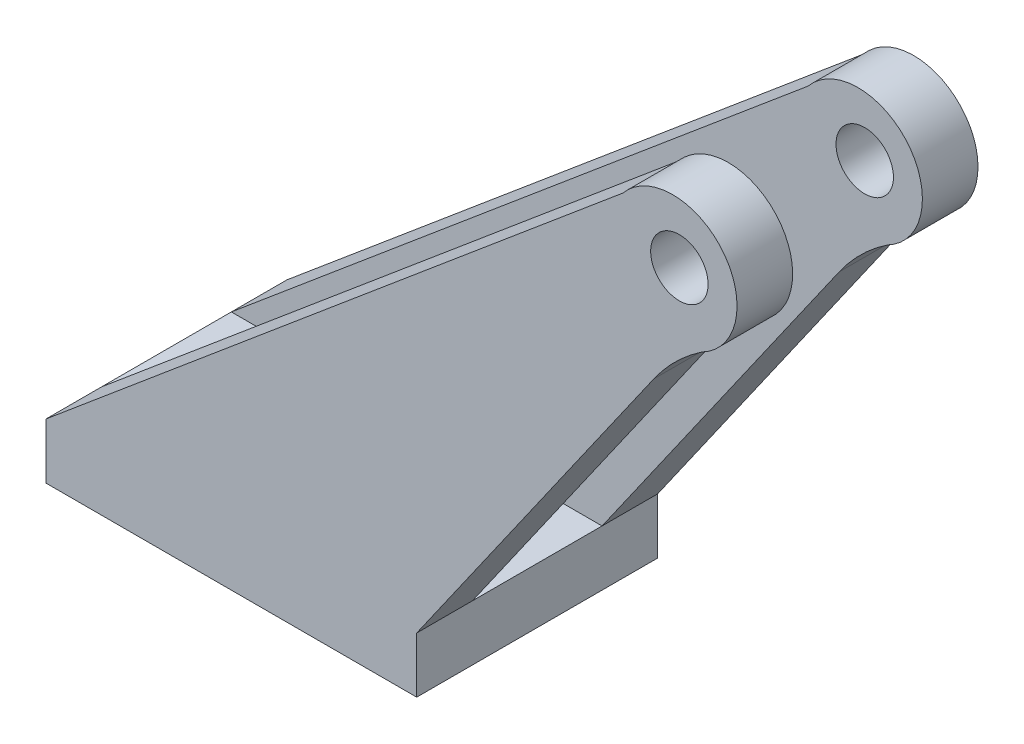
ISO-10303-21;
HEADER;
FILE_DESCRIPTION(('STEP AP214'),'2;1');
FILE_NAME('part.step','',(''),(''),'','','');
FILE_SCHEMA(('AUTOMOTIVE_DESIGN { 1 0 10303 214 1 1 1 1 }'));
ENDSEC;
DATA;
#1=APPLICATION_CONTEXT('core data for automotive mechanical design processes');
#2=APPLICATION_PROTOCOL_DEFINITION('international standard','automotive_design',2000,#1);
#3=PRODUCT_CONTEXT('',#1,'mechanical');
#4=PRODUCT('Part','Part','',(#3));
#5=PRODUCT_RELATED_PRODUCT_CATEGORY('part','',(#4));
#6=PRODUCT_DEFINITION_FORMATION('','',#4);
#7=PRODUCT_DEFINITION_CONTEXT('part definition',#1,'design');
#8=PRODUCT_DEFINITION('design','',#6,#7);
#9=PRODUCT_DEFINITION_SHAPE('','',#8);
#10=(LENGTH_UNIT() NAMED_UNIT(*) SI_UNIT(.MILLI.,.METRE.));
#11=(NAMED_UNIT(*) PLANE_ANGLE_UNIT() SI_UNIT($,.RADIAN.));
#12=(NAMED_UNIT(*) SI_UNIT($,.STERADIAN.) SOLID_ANGLE_UNIT());
#13=UNCERTAINTY_MEASURE_WITH_UNIT(LENGTH_MEASURE(1.E-05),#10,'distance_accuracy_value','');
#14=(GEOMETRIC_REPRESENTATION_CONTEXT(3) GLOBAL_UNCERTAINTY_ASSIGNED_CONTEXT((#13)) GLOBAL_UNIT_ASSIGNED_CONTEXT((#10,
#11,#12)) REPRESENTATION_CONTEXT('',''));
#15=CARTESIAN_POINT('',(0.,0.,0.));
#16=DIRECTION('',(0.,0.,1.));
#17=DIRECTION('',(1.,0.,0.));
#18=AXIS2_PLACEMENT_3D('',#15,#16,#17);
#19=CARTESIAN_POINT('',(66.3277408616516,15.5347398559066,-44.2194258680597));
#20=DIRECTION('',(0.,0.,1.));
#21=DIRECTION('',(1.,0.,0.));
#22=AXIS2_PLACEMENT_3D('',#19,#20,#21);
#23=PLANE('',#22);
#24=CARTESIAN_POINT('',(59.5129486185114,27.150635094611,-44.2194258680597));
#25=DIRECTION('',(0.,0.,-1.));
#26=DIRECTION('',(-1.,0.,0.));
#27=AXIS2_PLACEMENT_3D('',#24,#25,#26);
#28=CIRCLE('',#27,1.55);
#29=CARTESIAN_POINT('',(57.9629486185114,27.150635094611,-44.2194258680597));
#30=VERTEX_POINT('',#29);
#31=EDGE_CURVE('E93',#30,#30,#28,.F.);
#32=ORIENTED_EDGE('',*,*,#31,.T.);
#33=EDGE_LOOP('',(#32));
#34=FACE_BOUND('',#33,.T.);
#35=DIRECTION('',(0.766044443118982,0.642787609686535,0.));
#36=VECTOR('',#35,1.);
#37=CARTESIAN_POINT('',(56.4724291693294,29.1206290674007,-44.2194258680597));
#38=LINE('',#37,#36);
#39=CARTESIAN_POINT('',(25.3430756374335,3.,-44.2194258680597));
#40=VERTEX_POINT('',#39);
#41=CARTESIAN_POINT('',(56.4724291693294,29.1206290674007,-44.2194258680597));
#42=VERTEX_POINT('',#41);
#43=EDGE_CURVE('E112',#40,#42,#38,.T.);
#44=ORIENTED_EDGE('',*,*,#43,.T.);
#45=CARTESIAN_POINT('',(59.1535799659421,26.9161629802591,-44.2194258680597));
#46=DIRECTION('',(0.,0.,-1.));
#47=DIRECTION('',(-1.,0.,0.));
#48=AXIS2_PLACEMENT_3D('',#45,#46,#47);
#49=CIRCLE('',#48,3.47105752236036);
#50=CARTESIAN_POINT('',(60.7457464022657,23.8318078835526,-44.2194258680597));
#51=VERTEX_POINT('',#50);
#52=EDGE_CURVE('E75',#51,#42,#49,.F.);
#53=ORIENTED_EDGE('',*,*,#52,.F.);
#54=CARTESIAN_POINT('',(66.3277408616516,15.5347398559066,-44.2194258680597));
#55=DIRECTION('',(0.,0.,-1.));
#56=DIRECTION('',(-1.,0.,0.));
#57=AXIS2_PLACEMENT_3D('',#54,#55,#56);
#58=CIRCLE('',#57,10.);
#59=CARTESIAN_POINT('',(58.1362204187617,21.2705042194171,-44.2194258680597));
#60=VERTEX_POINT('',#59);
#61=EDGE_CURVE('E21',#51,#60,#58,.F.);
#62=ORIENTED_EDGE('',*,*,#61,.T.);
#63=DIRECTION('',(-0.573576436351045,-0.819152044288992,0.));
#64=VECTOR('',#63,1.);
#65=CARTESIAN_POINT('',(45.3430756374336,3.,-44.2194258680597));
#66=LINE('',#65,#64);
#67=CARTESIAN_POINT('',(45.3430756374336,3.,-44.2194258680597));
#68=VERTEX_POINT('',#67);
#69=EDGE_CURVE('E81',#60,#68,#66,.T.);
#70=ORIENTED_EDGE('',*,*,#69,.T.);
#71=DIRECTION('',(1.,0.,0.));
#72=VECTOR('',#71,1.);
#73=CARTESIAN_POINT('',(0.,3.,-44.2194258680597));
#74=LINE('',#73,#72);
#75=EDGE_CURVE('E102',#68,#40,#74,.F.);
#76=ORIENTED_EDGE('',*,*,#75,.T.);
#77=EDGE_LOOP('',(#44,#53,#62,#70,#76));
#78=FACE_BOUND('',#77,.T.);
#79=ADVANCED_FACE('F18',(#34,#78),#23,.F.);
#80=CARTESIAN_POINT('',(66.3277408616516,15.5347398559066,-41.2194258680597));
#81=DIRECTION('',(0.,0.,-1.));
#82=DIRECTION('',(-1.,0.,0.));
#83=AXIS2_PLACEMENT_3D('',#80,#81,#82);
#84=CYLINDRICAL_SURFACE('',#83,10.);
#85=DIRECTION('',(0.,0.,-1.));
#86=VECTOR('',#85,1.);
#87=CARTESIAN_POINT('',(60.7457464022657,23.8318078835526,-41.2194258680597));
#88=LINE('',#87,#86);
#89=CARTESIAN_POINT('',(60.7457464022657,23.8318078835526,-41.2194258680597));
#90=VERTEX_POINT('',#89);
#91=EDGE_CURVE('E114',#90,#51,#88,.T.);
#92=ORIENTED_EDGE('',*,*,#91,.F.);
#93=CARTESIAN_POINT('',(66.3277408616516,15.5347398559066,-41.2194258680597));
#94=DIRECTION('',(0.,0.,-1.));
#95=DIRECTION('',(-1.,0.,0.));
#96=AXIS2_PLACEMENT_3D('',#93,#94,#95);
#97=CIRCLE('',#96,10.);
#98=CARTESIAN_POINT('',(58.1362204187617,21.2705042194171,-41.2194258680597));
#99=VERTEX_POINT('',#98);
#100=EDGE_CURVE('E89',#99,#90,#97,.T.);
#101=ORIENTED_EDGE('',*,*,#100,.F.);
#102=DIRECTION('',(0.,0.,1.));
#103=VECTOR('',#102,1.);
#104=CARTESIAN_POINT('',(58.1362204187617,21.2705042194171,-41.2194258680597));
#105=LINE('',#104,#103);
#106=EDGE_CURVE('E86',#99,#60,#105,.F.);
#107=ORIENTED_EDGE('',*,*,#106,.T.);
#108=ORIENTED_EDGE('',*,*,#61,.F.);
#109=EDGE_LOOP('',(#92,#101,#107,#108));
#110=FACE_BOUND('',#109,.T.);
#111=ADVANCED_FACE('F87',(#110),#84,.F.);
#112=CARTESIAN_POINT('',(59.1535799659421,26.9161629802591,-41.2194258680597));
#113=DIRECTION('',(0.,0.,-1.));
#114=DIRECTION('',(-1.,0.,0.));
#115=AXIS2_PLACEMENT_3D('',#112,#113,#114);
#116=CYLINDRICAL_SURFACE('',#115,3.47105752236036);
#117=CARTESIAN_POINT('',(59.1535799659421,26.9161629802591,-41.2194258680597));
#118=DIRECTION('',(0.,0.,-1.));
#119=DIRECTION('',(-1.,0.,0.));
#120=AXIS2_PLACEMENT_3D('',#117,#118,#119);
#121=CIRCLE('',#120,3.47105752236036);
#122=CARTESIAN_POINT('',(56.4724291693294,29.1206290674007,-41.2194258680597));
#123=VERTEX_POINT('',#122);
#124=EDGE_CURVE('E149',#90,#123,#121,.F.);
#125=ORIENTED_EDGE('',*,*,#124,.F.);
#126=ORIENTED_EDGE('',*,*,#91,.T.);
#127=ORIENTED_EDGE('',*,*,#52,.T.);
#128=DIRECTION('',(0.,0.,1.));
#129=VECTOR('',#128,1.);
#130=CARTESIAN_POINT('',(56.4724291693294,29.1206290674007,-41.2194258680597));
#131=LINE('',#130,#129);
#132=EDGE_CURVE('E110',#42,#123,#131,.T.);
#133=ORIENTED_EDGE('',*,*,#132,.T.);
#134=EDGE_LOOP('',(#125,#126,#127,#133));
#135=FACE_BOUND('',#134,.T.);
#136=ADVANCED_FACE('F159',(#135),#116,.T.);
#137=CARTESIAN_POINT('',(59.5129486185114,27.150635094611,-41.2194258680597));
#138=DIRECTION('',(0.,0.,-1.));
#139=DIRECTION('',(-1.,0.,0.));
#140=AXIS2_PLACEMENT_3D('',#137,#138,#139);
#141=CYLINDRICAL_SURFACE('',#140,1.55);
#142=CARTESIAN_POINT('',(59.5129486185114,27.150635094611,-41.2194258680597));
#143=DIRECTION('',(0.,0.,-1.));
#144=DIRECTION('',(-1.,0.,0.));
#145=AXIS2_PLACEMENT_3D('',#142,#143,#144);
#146=CIRCLE('',#145,1.55);
#147=CARTESIAN_POINT('',(57.9629486185114,27.150635094611,-41.2194258680597));
#148=VERTEX_POINT('',#147);
#149=EDGE_CURVE('E144',#148,#148,#146,.T.);
#150=ORIENTED_EDGE('',*,*,#149,.F.);
#151=EDGE_LOOP('',(#150));
#152=FACE_BOUND('',#151,.T.);
#153=ORIENTED_EDGE('',*,*,#31,.F.);
#154=EDGE_LOOP('',(#153));
#155=FACE_BOUND('',#154,.T.);
#156=ADVANCED_FACE('F336',(#152,#155),#141,.F.);
#157=CARTESIAN_POINT('',(45.3430756374336,3.,-41.2194258680597));
#158=DIRECTION('',(-0.819152044288992,0.573576436351045,0.));
#159=DIRECTION('',(-0.573576436351045,-0.819152044288992,0.));
#160=AXIS2_PLACEMENT_3D('',#157,#158,#159);
#161=PLANE('',#160);
#162=ORIENTED_EDGE('',*,*,#106,.F.);
#163=DIRECTION('',(0.573576436351045,0.819152044288992,0.));
#164=VECTOR('',#163,1.);
#165=CARTESIAN_POINT('',(45.3430756374336,3.,-41.2194258680597));
#166=LINE('',#165,#164);
#167=CARTESIAN_POINT('',(45.3430756374336,3.,-41.2194258680597));
#168=VERTEX_POINT('',#167);
#169=EDGE_CURVE('E153',#168,#99,#166,.T.);
#170=ORIENTED_EDGE('',*,*,#169,.F.);
#171=DIRECTION('',(0.,0.,1.));
#172=VECTOR('',#171,1.);
#173=CARTESIAN_POINT('',(45.3430756374336,3.,-51.2194258680596));
#174=LINE('',#173,#172);
#175=EDGE_CURVE('E97',#168,#68,#174,.F.);
#176=ORIENTED_EDGE('',*,*,#175,.T.);
#177=ORIENTED_EDGE('',*,*,#69,.F.);
#178=EDGE_LOOP('',(#162,#170,#176,#177));
#179=FACE_BOUND('',#178,.T.);
#180=ADVANCED_FACE('F95',(#179),#161,.F.);
#181=CARTESIAN_POINT('',(40.3430756374337,3.,-47.7194258680598));
#182=DIRECTION('',(0.,-1.,0.));
#183=DIRECTION('',(0.,0.,-1.));
#184=AXIS2_PLACEMENT_3D('',#181,#182,#183);
#185=CYLINDRICAL_SURFACE('',#184,1.59999999999982);
#186=CARTESIAN_POINT('',(40.3430756374337,3.,-47.7194258680598));
#187=DIRECTION('',(0.,-1.,0.));
#188=DIRECTION('',(0.,0.,-1.));
#189=AXIS2_PLACEMENT_3D('',#186,#187,#188);
#190=CIRCLE('',#189,1.59999999999982);
#191=CARTESIAN_POINT('',(40.3430756374337,3.,-49.3194258680596));
#192=VERTEX_POINT('',#191);
#193=EDGE_CURVE('E99',#192,#192,#190,.F.);
#194=ORIENTED_EDGE('',*,*,#193,.T.);
#195=EDGE_LOOP('',(#194));
#196=FACE_BOUND('',#195,.T.);
#197=CARTESIAN_POINT('',(40.3430756374337,0.,-47.7194258680598));
#198=DIRECTION('',(0.,-1.,0.));
#199=DIRECTION('',(0.,0.,-1.));
#200=AXIS2_PLACEMENT_3D('',#197,#198,#199);
#201=CIRCLE('',#200,1.59999999999982);
#202=CARTESIAN_POINT('',(40.3430756374337,0.,-49.3194258680596));
#203=VERTEX_POINT('',#202);
#204=EDGE_CURVE('E139',#203,#203,#201,.F.);
#205=ORIENTED_EDGE('',*,*,#204,.F.);
#206=EDGE_LOOP('',(#205));
#207=FACE_BOUND('',#206,.T.);
#208=ADVANCED_FACE('F324',(#196,#207),#185,.F.);
#209=CARTESIAN_POINT('',(30.3430756374334,3.,-47.7194258680598));
#210=DIRECTION('',(0.,-1.,0.));
#211=DIRECTION('',(0.,0.,-1.));
#212=AXIS2_PLACEMENT_3D('',#209,#210,#211);
#213=CYLINDRICAL_SURFACE('',#212,1.59999999999982);
#214=CARTESIAN_POINT('',(30.3430756374334,3.,-47.7194258680598));
#215=DIRECTION('',(0.,-1.,0.));
#216=DIRECTION('',(0.,0.,-1.));
#217=AXIS2_PLACEMENT_3D('',#214,#215,#216);
#218=CIRCLE('',#217,1.59999999999982);
#219=CARTESIAN_POINT('',(30.3430756374334,3.,-49.3194258680596));
#220=VERTEX_POINT('',#219);
#221=EDGE_CURVE('E113',#220,#220,#218,.F.);
#222=ORIENTED_EDGE('',*,*,#221,.T.);
#223=EDGE_LOOP('',(#222));
#224=FACE_BOUND('',#223,.T.);
#225=CARTESIAN_POINT('',(30.3430756374334,0.,-47.7194258680598));
#226=DIRECTION('',(0.,-1.,0.));
#227=DIRECTION('',(0.,0.,-1.));
#228=AXIS2_PLACEMENT_3D('',#225,#226,#227);
#229=CIRCLE('',#228,1.59999999999982);
#230=CARTESIAN_POINT('',(30.3430756374334,0.,-49.3194258680596));
#231=VERTEX_POINT('',#230);
#232=EDGE_CURVE('E134',#231,#231,#229,.F.);
#233=ORIENTED_EDGE('',*,*,#232,.F.);
#234=EDGE_LOOP('',(#233));
#235=FACE_BOUND('',#234,.T.);
#236=ADVANCED_FACE('F326',(#224,#235),#213,.F.);
#237=CARTESIAN_POINT('',(0.,3.,0.));
#238=DIRECTION('',(0.,-1.,0.));
#239=DIRECTION('',(0.,0.,-1.));
#240=AXIS2_PLACEMENT_3D('',#237,#238,#239);
#241=PLANE('',#240);
#242=ORIENTED_EDGE('',*,*,#221,.F.);
#243=EDGE_LOOP('',(#242));
#244=FACE_BOUND('',#243,.T.);
#245=DIRECTION('',(-1.,0.,0.));
#246=VECTOR('',#245,1.);
#247=CARTESIAN_POINT('',(59.1535799659421,3.,-51.2194258680596));
#248=LINE('',#247,#246);
#249=CARTESIAN_POINT('',(45.3430756374336,3.,-51.2194258680596));
#250=VERTEX_POINT('',#249);
#251=CARTESIAN_POINT('',(25.3430756374335,2.99999999999999,-51.2194258680596));
#252=VERTEX_POINT('',#251);
#253=EDGE_CURVE('E147',#250,#252,#248,.T.);
#254=ORIENTED_EDGE('',*,*,#253,.T.);
#255=DIRECTION('',(0.,0.,-1.));
#256=VECTOR('',#255,1.);
#257=CARTESIAN_POINT('',(25.3430756374335,3.,-51.2194258680596));
#258=LINE('',#257,#256);
#259=EDGE_CURVE('E137',#252,#40,#258,.F.);
#260=ORIENTED_EDGE('',*,*,#259,.T.);
#261=ORIENTED_EDGE('',*,*,#75,.F.);
#262=DIRECTION('',(0.,0.,1.));
#263=VECTOR('',#262,1.);
#264=CARTESIAN_POINT('',(45.3430756374336,3.,-51.2194258680596));
#265=LINE('',#264,#263);
#266=EDGE_CURVE('E143',#68,#250,#265,.F.);
#267=ORIENTED_EDGE('',*,*,#266,.T.);
#268=EDGE_LOOP('',(#254,#260,#261,#267));
#269=FACE_BOUND('',#268,.T.);
#270=ORIENTED_EDGE('',*,*,#193,.F.);
#271=EDGE_LOOP('',(#270));
#272=FACE_BOUND('',#271,.T.);
#273=ADVANCED_FACE('F259',(#244,#269,#272),#241,.F.);
#274=CARTESIAN_POINT('',(56.4724291693294,29.1206290674007,-41.2194258680597));
#275=DIRECTION('',(0.642787609686535,-0.766044443118982,0.));
#276=DIRECTION('',(0.766044443118982,0.642787609686535,0.));
#277=AXIS2_PLACEMENT_3D('',#274,#275,#276);
#278=PLANE('',#277);
#279=DIRECTION('',(0.,0.,-1.));
#280=VECTOR('',#279,1.);
#281=CARTESIAN_POINT('',(25.3430756374335,3.,-51.2194258680596));
#282=LINE('',#281,#280);
#283=CARTESIAN_POINT('',(25.3430756374335,3.,-41.2194258680597));
#284=VERTEX_POINT('',#283);
#285=EDGE_CURVE('E172',#40,#284,#282,.F.);
#286=ORIENTED_EDGE('',*,*,#285,.T.);
#287=DIRECTION('',(-0.766044443118982,-0.642787609686535,0.));
#288=VECTOR('',#287,1.);
#289=CARTESIAN_POINT('',(56.4724291693294,29.1206290674007,-41.2194258680597));
#290=LINE('',#289,#288);
#291=EDGE_CURVE('E148',#123,#284,#290,.T.);
#292=ORIENTED_EDGE('',*,*,#291,.F.);
#293=ORIENTED_EDGE('',*,*,#132,.F.);
#294=ORIENTED_EDGE('',*,*,#43,.F.);
#295=EDGE_LOOP('',(#286,#292,#293,#294));
#296=FACE_BOUND('',#295,.T.);
#297=ADVANCED_FACE('F169',(#296),#278,.F.);
#298=CARTESIAN_POINT('',(66.3277408616516,15.5347398559066,-41.2194258680597));
#299=DIRECTION('',(0.,0.,1.));
#300=DIRECTION('',(1.,0.,0.));
#301=AXIS2_PLACEMENT_3D('',#298,#299,#300);
#302=PLANE('',#301);
#303=ORIENTED_EDGE('',*,*,#149,.T.);
#304=EDGE_LOOP('',(#303));
#305=FACE_BOUND('',#304,.T.);
#306=ORIENTED_EDGE('',*,*,#124,.T.);
#307=ORIENTED_EDGE('',*,*,#291,.T.);
#308=DIRECTION('',(0.,1.,0.));
#309=VECTOR('',#308,1.);
#310=CARTESIAN_POINT('',(25.3430756374335,3.,-41.2194258680597));
#311=LINE('',#310,#309);
#312=CARTESIAN_POINT('',(25.3430756374335,0.,-41.2194258680597));
#313=VERTEX_POINT('',#312);
#314=EDGE_CURVE('E189',#284,#313,#311,.F.);
#315=ORIENTED_EDGE('',*,*,#314,.T.);
#316=DIRECTION('',(1.,0.,0.));
#317=VECTOR('',#316,1.);
#318=CARTESIAN_POINT('',(0.,0.,-41.2194258680597));
#319=LINE('',#318,#317);
#320=CARTESIAN_POINT('',(45.3430756374336,0.,-41.2194258680597));
#321=VERTEX_POINT('',#320);
#322=EDGE_CURVE('E138',#321,#313,#319,.F.);
#323=ORIENTED_EDGE('',*,*,#322,.F.);
#324=DIRECTION('',(0.,1.,0.));
#325=VECTOR('',#324,1.);
#326=CARTESIAN_POINT('',(45.3430756374336,3.,-41.2194258680597));
#327=LINE('',#326,#325);
#328=EDGE_CURVE('E181',#321,#168,#327,.T.);
#329=ORIENTED_EDGE('',*,*,#328,.T.);
#330=ORIENTED_EDGE('',*,*,#169,.T.);
#331=ORIENTED_EDGE('',*,*,#100,.T.);
#332=EDGE_LOOP('',(#306,#307,#315,#323,#329,#330,#331));
#333=FACE_BOUND('',#332,.T.);
#334=ADVANCED_FACE('F177',(#305,#333),#302,.T.);
#335=CARTESIAN_POINT('',(59.1535799659421,26.9161629802591,-51.2194258680596));
#336=DIRECTION('',(0.,0.,-1.));
#337=DIRECTION('',(-1.,0.,0.));
#338=AXIS2_PLACEMENT_3D('',#335,#336,#337);
#339=PLANE('',#338);
#340=CARTESIAN_POINT('',(59.5129486185114,27.150635094611,-51.2194258680596));
#341=DIRECTION('',(0.,0.,1.));
#342=DIRECTION('',(1.,0.,0.));
#343=AXIS2_PLACEMENT_3D('',#340,#341,#342);
#344=CIRCLE('',#343,1.55);
#345=CARTESIAN_POINT('',(61.0629486185114,27.150635094611,-51.2194258680596));
#346=VERTEX_POINT('',#345);
#347=EDGE_CURVE('E122',#346,#346,#344,.F.);
#348=ORIENTED_EDGE('',*,*,#347,.T.);
#349=EDGE_LOOP('',(#348));
#350=FACE_BOUND('',#349,.T.);
#351=DIRECTION('',(-0.573576436351045,-0.819152044288992,0.));
#352=VECTOR('',#351,1.);
#353=CARTESIAN_POINT('',(45.3430756374336,3.,-51.2194258680596));
#354=LINE('',#353,#352);
#355=CARTESIAN_POINT('',(58.1362204187617,21.2705042194171,-51.2194258680596));
#356=VERTEX_POINT('',#355);
#357=EDGE_CURVE('E126',#250,#356,#354,.F.);
#358=ORIENTED_EDGE('',*,*,#357,.T.);
#359=CARTESIAN_POINT('',(66.3277408616516,15.5347398559066,-51.2194258680596));
#360=DIRECTION('',(0.,0.,1.));
#361=DIRECTION('',(1.,0.,0.));
#362=AXIS2_PLACEMENT_3D('',#359,#360,#361);
#363=CIRCLE('',#362,9.99999999999999);
#364=CARTESIAN_POINT('',(60.7457464022658,23.8318078835526,-51.2194258680596));
#365=VERTEX_POINT('',#364);
#366=EDGE_CURVE('E127',#356,#365,#363,.F.);
#367=ORIENTED_EDGE('',*,*,#366,.T.);
#368=CARTESIAN_POINT('',(59.1535799659421,26.9161629802591,-51.2194258680596));
#369=DIRECTION('',(0.,0.,1.));
#370=DIRECTION('',(1.,0.,0.));
#371=AXIS2_PLACEMENT_3D('',#368,#369,#370);
#372=CIRCLE('',#371,3.47105752236036);
#373=CARTESIAN_POINT('',(56.4724291693294,29.1206290674007,-51.2194258680596));
#374=VERTEX_POINT('',#373);
#375=EDGE_CURVE('E131',#374,#365,#372,.F.);
#376=ORIENTED_EDGE('',*,*,#375,.F.);
#377=DIRECTION('',(0.766044443118982,0.642787609686535,0.));
#378=VECTOR('',#377,1.);
#379=CARTESIAN_POINT('',(56.4724291693294,29.1206290674007,-51.2194258680596));
#380=LINE('',#379,#378);
#381=EDGE_CURVE('E211',#374,#252,#380,.F.);
#382=ORIENTED_EDGE('',*,*,#381,.T.);
#383=ORIENTED_EDGE('',*,*,#253,.F.);
#384=EDGE_LOOP('',(#358,#367,#376,#382,#383));
#385=FACE_BOUND('',#384,.T.);
#386=ADVANCED_FACE('F269',(#350,#385),#339,.F.);
#387=CARTESIAN_POINT('',(45.3430756374336,3.,-51.2194258680596));
#388=DIRECTION('',(-1.,0.,0.));
#389=DIRECTION('',(0.,0.,1.));
#390=AXIS2_PLACEMENT_3D('',#387,#388,#389);
#391=PLANE('',#390);
#392=DIRECTION('',(0.,1.,0.));
#393=VECTOR('',#392,1.);
#394=CARTESIAN_POINT('',(45.3430756374336,26.9161629802591,-54.2194258680596));
#395=LINE('',#394,#393);
#396=CARTESIAN_POINT('',(45.3430756374336,3.,-54.2194258680596));
#397=VERTEX_POINT('',#396);
#398=CARTESIAN_POINT('',(45.3430756374336,0.,-54.2194258680596));
#399=VERTEX_POINT('',#398);
#400=EDGE_CURVE('E125',#397,#399,#395,.F.);
#401=ORIENTED_EDGE('',*,*,#400,.F.);
#402=DIRECTION('',(0.,0.,1.));
#403=VECTOR('',#402,1.);
#404=CARTESIAN_POINT('',(45.3430756374336,3.,-54.2194258680596));
#405=LINE('',#404,#403);
#406=EDGE_CURVE('E255',#397,#250,#405,.T.);
#407=ORIENTED_EDGE('',*,*,#406,.T.);
#408=ORIENTED_EDGE('',*,*,#266,.F.);
#409=ORIENTED_EDGE('',*,*,#175,.F.);
#410=ORIENTED_EDGE('',*,*,#328,.F.);
#411=DIRECTION('',(0.,0.,-1.));
#412=VECTOR('',#411,1.);
#413=CARTESIAN_POINT('',(45.3430756374336,0.,0.));
#414=LINE('',#413,#412);
#415=EDGE_CURVE('E142',#399,#321,#414,.F.);
#416=ORIENTED_EDGE('',*,*,#415,.F.);
#417=EDGE_LOOP('',(#401,#407,#408,#409,#410,#416));
#418=FACE_BOUND('',#417,.T.);
#419=ADVANCED_FACE('F307',(#418),#391,.F.);
#420=CARTESIAN_POINT('',(0.,0.,0.));
#421=DIRECTION('',(0.,-1.,0.));
#422=DIRECTION('',(0.,0.,-1.));
#423=AXIS2_PLACEMENT_3D('',#420,#421,#422);
#424=PLANE('',#423);
#425=ORIENTED_EDGE('',*,*,#232,.T.);
#426=EDGE_LOOP('',(#425));
#427=FACE_BOUND('',#426,.T.);
#428=DIRECTION('',(0.,0.,-1.));
#429=VECTOR('',#428,1.);
#430=CARTESIAN_POINT('',(25.3430756374335,0.,-51.2194258680596));
#431=LINE('',#430,#429);
#432=CARTESIAN_POINT('',(25.3430756374335,0.,-54.2194258680596));
#433=VERTEX_POINT('',#432);
#434=EDGE_CURVE('E225',#313,#433,#431,.T.);
#435=ORIENTED_EDGE('',*,*,#434,.T.);
#436=DIRECTION('',(-1.,0.,0.));
#437=VECTOR('',#436,1.);
#438=CARTESIAN_POINT('',(59.1535799659421,0.,-54.2194258680596));
#439=LINE('',#438,#437);
#440=EDGE_CURVE('E243',#399,#433,#439,.T.);
#441=ORIENTED_EDGE('',*,*,#440,.F.);
#442=ORIENTED_EDGE('',*,*,#415,.T.);
#443=ORIENTED_EDGE('',*,*,#322,.T.);
#444=EDGE_LOOP('',(#435,#441,#442,#443));
#445=FACE_BOUND('',#444,.T.);
#446=ORIENTED_EDGE('',*,*,#204,.T.);
#447=EDGE_LOOP('',(#446));
#448=FACE_BOUND('',#447,.T.);
#449=ADVANCED_FACE('F317',(#427,#445,#448),#424,.T.);
#450=CARTESIAN_POINT('',(25.3430756374335,3.,-51.2194258680596));
#451=DIRECTION('',(1.,0.,0.));
#452=DIRECTION('',(0.,0.,-1.));
#453=AXIS2_PLACEMENT_3D('',#450,#451,#452);
#454=PLANE('',#453);
#455=ORIENTED_EDGE('',*,*,#314,.F.);
#456=ORIENTED_EDGE('',*,*,#285,.F.);
#457=ORIENTED_EDGE('',*,*,#259,.F.);
#458=DIRECTION('',(0.,0.,1.));
#459=VECTOR('',#458,1.);
#460=CARTESIAN_POINT('',(25.3430756374335,3.,-54.2194258680596));
#461=LINE('',#460,#459);
#462=CARTESIAN_POINT('',(25.3430756374335,3.,-54.2194258680596));
#463=VERTEX_POINT('',#462);
#464=EDGE_CURVE('E214',#252,#463,#461,.F.);
#465=ORIENTED_EDGE('',*,*,#464,.T.);
#466=DIRECTION('',(0.,1.,0.));
#467=VECTOR('',#466,1.);
#468=CARTESIAN_POINT('',(25.3430756374335,26.9161629802591,-54.2194258680596));
#469=LINE('',#468,#467);
#470=EDGE_CURVE('E246',#433,#463,#469,.T.);
#471=ORIENTED_EDGE('',*,*,#470,.F.);
#472=ORIENTED_EDGE('',*,*,#434,.F.);
#473=EDGE_LOOP('',(#455,#456,#457,#465,#471,#472));
#474=FACE_BOUND('',#473,.T.);
#475=ADVANCED_FACE('F265',(#474),#454,.F.);
#476=CARTESIAN_POINT('',(56.4724291693294,29.1206290674007,-54.2194258680596));
#477=DIRECTION('',(0.642787609686535,-0.766044443118982,0.));
#478=DIRECTION('',(0.766044443118982,0.642787609686535,0.));
#479=AXIS2_PLACEMENT_3D('',#476,#477,#478);
#480=PLANE('',#479);
#481=DIRECTION('',(0.,0.,1.));
#482=VECTOR('',#481,1.);
#483=CARTESIAN_POINT('',(56.4724291693294,29.1206290674007,-54.2194258680596));
#484=LINE('',#483,#482);
#485=CARTESIAN_POINT('',(56.4724291693294,29.1206290674007,-54.2194258680596));
#486=VERTEX_POINT('',#485);
#487=EDGE_CURVE('E133',#486,#374,#484,.T.);
#488=ORIENTED_EDGE('',*,*,#487,.F.);
#489=DIRECTION('',(0.766044443118982,0.642787609686535,0.));
#490=VECTOR('',#489,1.);
#491=CARTESIAN_POINT('',(25.3430756374335,3.,-54.2194258680596));
#492=LINE('',#491,#490);
#493=EDGE_CURVE('E121',#463,#486,#492,.T.);
#494=ORIENTED_EDGE('',*,*,#493,.F.);
#495=ORIENTED_EDGE('',*,*,#464,.F.);
#496=ORIENTED_EDGE('',*,*,#381,.F.);
#497=EDGE_LOOP('',(#488,#494,#495,#496));
#498=FACE_BOUND('',#497,.T.);
#499=ADVANCED_FACE('F272',(#498),#480,.F.);
#500=CARTESIAN_POINT('',(59.1535799659421,26.9161629802591,-54.2194258680596));
#501=DIRECTION('',(0.,0.,1.));
#502=DIRECTION('',(1.,0.,0.));
#503=AXIS2_PLACEMENT_3D('',#500,#501,#502);
#504=CYLINDRICAL_SURFACE('',#503,3.47105752236036);
#505=ORIENTED_EDGE('',*,*,#375,.T.);
#506=DIRECTION('',(0.,0.,1.));
#507=VECTOR('',#506,1.);
#508=CARTESIAN_POINT('',(60.7457464022657,23.8318078835526,-54.2194258680596));
#509=LINE('',#508,#507);
#510=CARTESIAN_POINT('',(60.7457464022658,23.8318078835526,-54.2194258680596));
#511=VERTEX_POINT('',#510);
#512=EDGE_CURVE('E130',#365,#511,#509,.F.);
#513=ORIENTED_EDGE('',*,*,#512,.T.);
#514=CARTESIAN_POINT('',(59.1535799659421,26.9161629802591,-54.2194258680596));
#515=DIRECTION('',(0.,0.,1.));
#516=DIRECTION('',(1.,0.,0.));
#517=AXIS2_PLACEMENT_3D('',#514,#515,#516);
#518=CIRCLE('',#517,3.47105752236036);
#519=EDGE_CURVE('E119',#486,#511,#518,.F.);
#520=ORIENTED_EDGE('',*,*,#519,.F.);
#521=ORIENTED_EDGE('',*,*,#487,.T.);
#522=EDGE_LOOP('',(#505,#513,#520,#521));
#523=FACE_BOUND('',#522,.T.);
#524=ADVANCED_FACE('F353',(#523),#504,.T.);
#525=CARTESIAN_POINT('',(66.3277408616516,15.5347398559066,-54.2194258680596));
#526=DIRECTION('',(0.,0.,1.));
#527=DIRECTION('',(1.,0.,0.));
#528=AXIS2_PLACEMENT_3D('',#525,#526,#527);
#529=CYLINDRICAL_SURFACE('',#528,9.99999999999999);
#530=DIRECTION('',(0.,0.,1.));
#531=VECTOR('',#530,1.);
#532=CARTESIAN_POINT('',(58.1362204187617,21.2705042194171,-54.2194258680596));
#533=LINE('',#532,#531);
#534=CARTESIAN_POINT('',(58.1362204187617,21.2705042194171,-54.2194258680596));
#535=VERTEX_POINT('',#534);
#536=EDGE_CURVE('E36',#356,#535,#533,.F.);
#537=ORIENTED_EDGE('',*,*,#536,.T.);
#538=CARTESIAN_POINT('',(66.3277408616516,15.5347398559066,-54.2194258680596));
#539=DIRECTION('',(0.,0.,1.));
#540=DIRECTION('',(1.,0.,0.));
#541=AXIS2_PLACEMENT_3D('',#538,#539,#540);
#542=CIRCLE('',#541,9.99999999999999);
#543=EDGE_CURVE('E116',#511,#535,#542,.T.);
#544=ORIENTED_EDGE('',*,*,#543,.F.);
#545=ORIENTED_EDGE('',*,*,#512,.F.);
#546=ORIENTED_EDGE('',*,*,#366,.F.);
#547=EDGE_LOOP('',(#537,#544,#545,#546));
#548=FACE_BOUND('',#547,.T.);
#549=ADVANCED_FACE('F350',(#548),#529,.F.);
#550=CARTESIAN_POINT('',(45.3430756374336,3.,-54.2194258680596));
#551=DIRECTION('',(-0.819152044288992,0.573576436351045,0.));
#552=DIRECTION('',(-0.573576436351045,-0.819152044288992,0.));
#553=AXIS2_PLACEMENT_3D('',#550,#551,#552);
#554=PLANE('',#553);
#555=ORIENTED_EDGE('',*,*,#406,.F.);
#556=DIRECTION('',(-0.573576436351045,-0.819152044288992,0.));
#557=VECTOR('',#556,1.);
#558=CARTESIAN_POINT('',(58.1362204187617,21.2705042194171,-54.2194258680596));
#559=LINE('',#558,#557);
#560=EDGE_CURVE('E27',#535,#397,#559,.T.);
#561=ORIENTED_EDGE('',*,*,#560,.F.);
#562=ORIENTED_EDGE('',*,*,#536,.F.);
#563=ORIENTED_EDGE('',*,*,#357,.F.);
#564=EDGE_LOOP('',(#555,#561,#562,#563));
#565=FACE_BOUND('',#564,.T.);
#566=ADVANCED_FACE('F305',(#565),#554,.F.);
#567=CARTESIAN_POINT('',(59.5129486185114,27.150635094611,-54.2194258680596));
#568=DIRECTION('',(0.,0.,1.));
#569=DIRECTION('',(1.,0.,0.));
#570=AXIS2_PLACEMENT_3D('',#567,#568,#569);
#571=CYLINDRICAL_SURFACE('',#570,1.55);
#572=CARTESIAN_POINT('',(59.5129486185114,27.150635094611,-54.2194258680596));
#573=DIRECTION('',(0.,0.,1.));
#574=DIRECTION('',(1.,0.,0.));
#575=AXIS2_PLACEMENT_3D('',#572,#573,#574);
#576=CIRCLE('',#575,1.55);
#577=CARTESIAN_POINT('',(61.0629486185114,27.150635094611,-54.2194258680596));
#578=VERTEX_POINT('',#577);
#579=EDGE_CURVE('E11',#578,#578,#576,.T.);
#580=ORIENTED_EDGE('',*,*,#579,.F.);
#581=EDGE_LOOP('',(#580));
#582=FACE_BOUND('',#581,.T.);
#583=ORIENTED_EDGE('',*,*,#347,.F.);
#584=EDGE_LOOP('',(#583));
#585=FACE_BOUND('',#584,.T.);
#586=ADVANCED_FACE('F339',(#582,#585),#571,.F.);
#587=CARTESIAN_POINT('',(59.1535799659421,26.9161629802591,-54.2194258680596));
#588=DIRECTION('',(0.,0.,-1.));
#589=DIRECTION('',(-1.,0.,0.));
#590=AXIS2_PLACEMENT_3D('',#587,#588,#589);
#591=PLANE('',#590);
#592=ORIENTED_EDGE('',*,*,#579,.T.);
#593=EDGE_LOOP('',(#592));
#594=FACE_BOUND('',#593,.T.);
#595=ORIENTED_EDGE('',*,*,#543,.T.);
#596=ORIENTED_EDGE('',*,*,#560,.T.);
#597=ORIENTED_EDGE('',*,*,#400,.T.);
#598=ORIENTED_EDGE('',*,*,#440,.T.);
#599=ORIENTED_EDGE('',*,*,#470,.T.);
#600=ORIENTED_EDGE('',*,*,#493,.T.);
#601=ORIENTED_EDGE('',*,*,#519,.T.);
#602=EDGE_LOOP('',(#595,#596,#597,#598,#599,#600,#601));
#603=FACE_BOUND('',#602,.T.);
#604=ADVANCED_FACE('F279',(#594,#603),#591,.T.);
#605=CLOSED_SHELL('',(#79,#111,#136,#156,#180,#208,#236,#273,#297,#334,#386,#419,#449,#475,#499,
#524,#549,#566,#586,#604));
#606=MANIFOLD_SOLID_BREP('B1',#605);
#607=ADVANCED_BREP_SHAPE_REPRESENTATION('',(#18,#606),#14);
#608=SHAPE_DEFINITION_REPRESENTATION(#9,#607);
ENDSEC;
END-ISO-10303-21;
